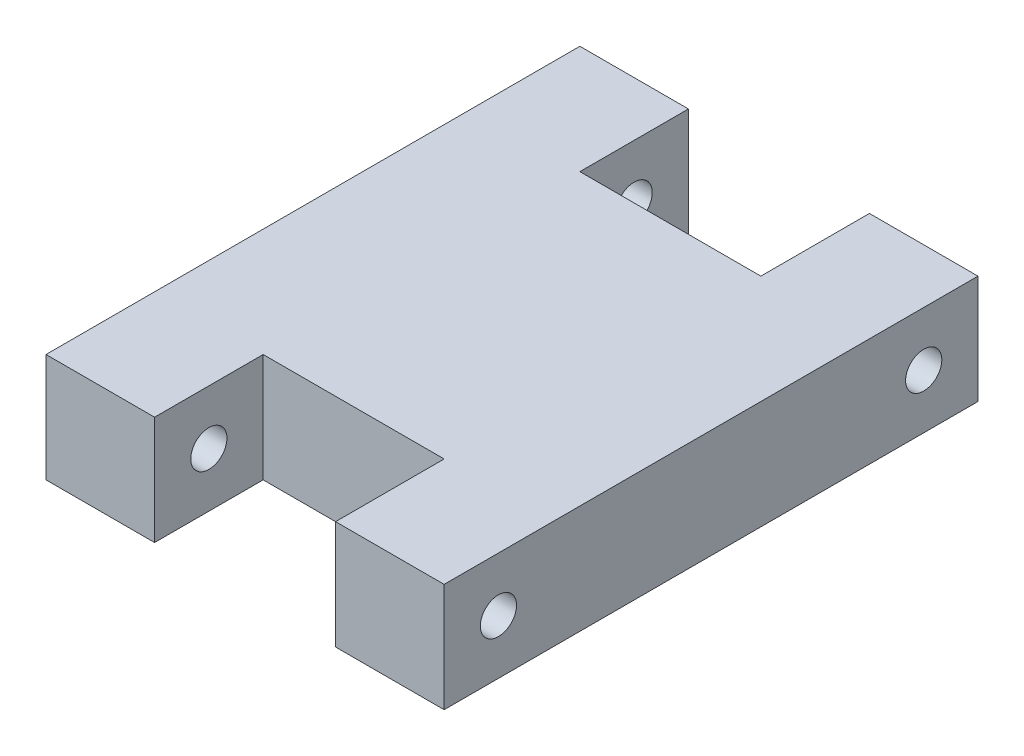
ISO-10303-21;
HEADER;
FILE_DESCRIPTION(('STEP AP214'),'2;1');
FILE_NAME('part.step','',(''),(''),'','','');
FILE_SCHEMA(('AUTOMOTIVE_DESIGN { 1 0 10303 214 1 1 1 1 }'));
ENDSEC;
DATA;
#1=APPLICATION_CONTEXT('core data for automotive mechanical design processes');
#2=APPLICATION_PROTOCOL_DEFINITION('international standard','automotive_design',2000,#1);
#3=PRODUCT_CONTEXT('',#1,'mechanical');
#4=PRODUCT('Part','Part','',(#3));
#5=PRODUCT_RELATED_PRODUCT_CATEGORY('part','',(#4));
#6=PRODUCT_DEFINITION_FORMATION('','',#4);
#7=PRODUCT_DEFINITION_CONTEXT('part definition',#1,'design');
#8=PRODUCT_DEFINITION('design','',#6,#7);
#9=PRODUCT_DEFINITION_SHAPE('','',#8);
#10=(LENGTH_UNIT() NAMED_UNIT(*) SI_UNIT(.MILLI.,.METRE.));
#11=(NAMED_UNIT(*) PLANE_ANGLE_UNIT() SI_UNIT($,.RADIAN.));
#12=(NAMED_UNIT(*) SI_UNIT($,.STERADIAN.) SOLID_ANGLE_UNIT());
#13=UNCERTAINTY_MEASURE_WITH_UNIT(LENGTH_MEASURE(1.E-05),#10,'distance_accuracy_value','');
#14=(GEOMETRIC_REPRESENTATION_CONTEXT(3) GLOBAL_UNCERTAINTY_ASSIGNED_CONTEXT((#13)) GLOBAL_UNIT_ASSIGNED_CONTEXT((#10,
#11,#12)) REPRESENTATION_CONTEXT('',''));
#15=CARTESIAN_POINT('',(0.,0.,0.));
#16=DIRECTION('',(0.,0.,1.));
#17=DIRECTION('',(1.,0.,0.));
#18=AXIS2_PLACEMENT_3D('',#15,#16,#17);
#19=CARTESIAN_POINT('',(22.,12.,29.5));
#20=DIRECTION('',(-1.,0.,0.));
#21=DIRECTION('',(0.,0.,1.));
#22=AXIS2_PLACEMENT_3D('',#19,#20,#21);
#23=PLANE('',#22);
#24=DIRECTION('',(0.,0.,-1.));
#25=VECTOR('',#24,1.);
#26=CARTESIAN_POINT('',(22.,0.,29.5));
#27=LINE('',#26,#25);
#28=CARTESIAN_POINT('',(22.,0.,29.5));
#29=VERTEX_POINT('',#28);
#30=CARTESIAN_POINT('',(22.,0.,-29.5));
#31=VERTEX_POINT('',#30);
#32=EDGE_CURVE('E218',#29,#31,#27,.T.);
#33=ORIENTED_EDGE('',*,*,#32,.T.);
#34=DIRECTION('',(0.,-1.,0.));
#35=VECTOR('',#34,1.);
#36=CARTESIAN_POINT('',(22.,12.,-29.5));
#37=LINE('',#36,#35);
#38=CARTESIAN_POINT('',(22.,12.,-29.5));
#39=VERTEX_POINT('',#38);
#40=EDGE_CURVE('E11',#39,#31,#37,.T.);
#41=ORIENTED_EDGE('',*,*,#40,.F.);
#42=DIRECTION('',(0.,0.,-1.));
#43=VECTOR('',#42,1.);
#44=CARTESIAN_POINT('',(22.,12.,29.5));
#45=LINE('',#44,#43);
#46=CARTESIAN_POINT('',(22.,12.,29.5));
#47=VERTEX_POINT('',#46);
#48=EDGE_CURVE('E149',#47,#39,#45,.T.);
#49=ORIENTED_EDGE('',*,*,#48,.F.);
#50=DIRECTION('',(0.,-1.,0.));
#51=VECTOR('',#50,1.);
#52=CARTESIAN_POINT('',(22.,12.,29.5));
#53=LINE('',#52,#51);
#54=EDGE_CURVE('E159',#47,#29,#53,.T.);
#55=ORIENTED_EDGE('',*,*,#54,.T.);
#56=EDGE_LOOP('',(#33,#41,#49,#55));
#57=FACE_BOUND('',#56,.T.);
#58=CARTESIAN_POINT('',(22.,6.,-23.5));
#59=DIRECTION('',(-1.,0.,0.));
#60=DIRECTION('',(0.,0.,1.));
#61=AXIS2_PLACEMENT_3D('',#58,#59,#60);
#62=CIRCLE('',#61,2.);
#63=CARTESIAN_POINT('',(22.,6.,-21.5));
#64=VERTEX_POINT('',#63);
#65=EDGE_CURVE('E168',#64,#64,#62,.F.);
#66=ORIENTED_EDGE('',*,*,#65,.F.);
#67=EDGE_LOOP('',(#66));
#68=FACE_BOUND('',#67,.T.);
#69=CARTESIAN_POINT('',(22.,6.,23.5));
#70=DIRECTION('',(-1.,0.,0.));
#71=DIRECTION('',(0.,0.,1.));
#72=AXIS2_PLACEMENT_3D('',#69,#70,#71);
#73=CIRCLE('',#72,2.);
#74=CARTESIAN_POINT('',(22.,6.,25.5));
#75=VERTEX_POINT('',#74);
#76=EDGE_CURVE('E395',#75,#75,#73,.T.);
#77=ORIENTED_EDGE('',*,*,#76,.T.);
#78=EDGE_LOOP('',(#77));
#79=FACE_BOUND('',#78,.T.);
#80=ADVANCED_FACE('F32',(#57,#68,#79),#23,.F.);
#81=CARTESIAN_POINT('',(-22.,12.,29.5));
#82=DIRECTION('',(1.,0.,0.));
#83=DIRECTION('',(0.,0.,-1.));
#84=AXIS2_PLACEMENT_3D('',#81,#82,#83);
#85=PLANE('',#84);
#86=DIRECTION('',(0.,0.,1.));
#87=VECTOR('',#86,1.);
#88=CARTESIAN_POINT('',(-22.,0.,29.5));
#89=LINE('',#88,#87);
#90=CARTESIAN_POINT('',(-22.,0.,-29.5));
#91=VERTEX_POINT('',#90);
#92=CARTESIAN_POINT('',(-22.,0.,29.5));
#93=VERTEX_POINT('',#92);
#94=EDGE_CURVE('E155',#91,#93,#89,.T.);
#95=ORIENTED_EDGE('',*,*,#94,.T.);
#96=DIRECTION('',(0.,-1.,0.));
#97=VECTOR('',#96,1.);
#98=CARTESIAN_POINT('',(-22.,12.,29.5));
#99=LINE('',#98,#97);
#100=CARTESIAN_POINT('',(-22.,12.,29.5));
#101=VERTEX_POINT('',#100);
#102=EDGE_CURVE('E148',#101,#93,#99,.T.);
#103=ORIENTED_EDGE('',*,*,#102,.F.);
#104=DIRECTION('',(0.,0.,1.));
#105=VECTOR('',#104,1.);
#106=CARTESIAN_POINT('',(-22.,12.,29.5));
#107=LINE('',#106,#105);
#108=CARTESIAN_POINT('',(-22.,12.,-29.5));
#109=VERTEX_POINT('',#108);
#110=EDGE_CURVE('E223',#109,#101,#107,.T.);
#111=ORIENTED_EDGE('',*,*,#110,.F.);
#112=DIRECTION('',(0.,-1.,0.));
#113=VECTOR('',#112,1.);
#114=CARTESIAN_POINT('',(-22.,12.,-29.5));
#115=LINE('',#114,#113);
#116=EDGE_CURVE('E40',#109,#91,#115,.T.);
#117=ORIENTED_EDGE('',*,*,#116,.T.);
#118=EDGE_LOOP('',(#95,#103,#111,#117));
#119=FACE_BOUND('',#118,.T.);
#120=CARTESIAN_POINT('',(-22.,6.,-23.5));
#121=DIRECTION('',(-1.,0.,0.));
#122=DIRECTION('',(0.,0.,1.));
#123=AXIS2_PLACEMENT_3D('',#120,#121,#122);
#124=CIRCLE('',#123,2.);
#125=CARTESIAN_POINT('',(-22.,6.,-21.5));
#126=VERTEX_POINT('',#125);
#127=EDGE_CURVE('E175',#126,#126,#124,.T.);
#128=ORIENTED_EDGE('',*,*,#127,.F.);
#129=EDGE_LOOP('',(#128));
#130=FACE_BOUND('',#129,.T.);
#131=CARTESIAN_POINT('',(-22.,6.,23.5));
#132=DIRECTION('',(1.,0.,0.));
#133=DIRECTION('',(0.,0.,-1.));
#134=AXIS2_PLACEMENT_3D('',#131,#132,#133);
#135=CIRCLE('',#134,2.);
#136=CARTESIAN_POINT('',(-22.,6.,21.5));
#137=VERTEX_POINT('',#136);
#138=EDGE_CURVE('E391',#137,#137,#135,.T.);
#139=ORIENTED_EDGE('',*,*,#138,.T.);
#140=EDGE_LOOP('',(#139));
#141=FACE_BOUND('',#140,.T.);
#142=ADVANCED_FACE('F240',(#119,#130,#141),#85,.F.);
#143=CARTESIAN_POINT('',(-10.,-0.000999999999999265,29.5));
#144=DIRECTION('',(-1.,0.,0.));
#145=DIRECTION('',(0.,0.,1.));
#146=AXIS2_PLACEMENT_3D('',#143,#144,#145);
#147=PLANE('',#146);
#148=DIRECTION('',(0.,1.,0.));
#149=VECTOR('',#148,1.);
#150=CARTESIAN_POINT('',(-10.,-0.000999999999999265,17.5));
#151=LINE('',#150,#149);
#152=CARTESIAN_POINT('',(-10.,0.,17.5));
#153=VERTEX_POINT('',#152);
#154=CARTESIAN_POINT('',(-10.,12.,17.5));
#155=VERTEX_POINT('',#154);
#156=EDGE_CURVE('E191',#153,#155,#151,.T.);
#157=ORIENTED_EDGE('',*,*,#156,.T.);
#158=DIRECTION('',(0.,0.,1.));
#159=VECTOR('',#158,1.);
#160=CARTESIAN_POINT('',(-10.,12.,29.5));
#161=LINE('',#160,#159);
#162=CARTESIAN_POINT('',(-10.,12.,29.5));
#163=VERTEX_POINT('',#162);
#164=EDGE_CURVE('E128',#155,#163,#161,.T.);
#165=ORIENTED_EDGE('',*,*,#164,.T.);
#166=DIRECTION('',(0.,1.,0.));
#167=VECTOR('',#166,1.);
#168=CARTESIAN_POINT('',(-10.,-0.000999999999999265,29.5));
#169=LINE('',#168,#167);
#170=CARTESIAN_POINT('',(-10.,0.,29.5));
#171=VERTEX_POINT('',#170);
#172=EDGE_CURVE('E121',#171,#163,#169,.T.);
#173=ORIENTED_EDGE('',*,*,#172,.F.);
#174=DIRECTION('',(0.,0.,1.));
#175=VECTOR('',#174,1.);
#176=CARTESIAN_POINT('',(-10.,0.,29.5));
#177=LINE('',#176,#175);
#178=EDGE_CURVE('E125',#153,#171,#177,.T.);
#179=ORIENTED_EDGE('',*,*,#178,.F.);
#180=EDGE_LOOP('',(#157,#165,#173,#179));
#181=FACE_BOUND('',#180,.T.);
#182=CARTESIAN_POINT('',(-10.,6.,23.5));
#183=DIRECTION('',(-1.,0.,0.));
#184=DIRECTION('',(0.,0.,1.));
#185=AXIS2_PLACEMENT_3D('',#182,#183,#184);
#186=CIRCLE('',#185,2.);
#187=CARTESIAN_POINT('',(-10.,6.,25.5));
#188=VERTEX_POINT('',#187);
#189=EDGE_CURVE('E180',#188,#188,#186,.F.);
#190=ORIENTED_EDGE('',*,*,#189,.F.);
#191=EDGE_LOOP('',(#190));
#192=FACE_BOUND('',#191,.T.);
#193=ADVANCED_FACE('F123',(#181,#192),#147,.F.);
#194=CARTESIAN_POINT('',(10.,-0.000999999999999265,29.5));
#195=DIRECTION('',(1.,0.,0.));
#196=DIRECTION('',(0.,0.,-1.));
#197=AXIS2_PLACEMENT_3D('',#194,#195,#196);
#198=PLANE('',#197);
#199=DIRECTION('',(0.,1.,0.));
#200=VECTOR('',#199,1.);
#201=CARTESIAN_POINT('',(10.,-0.000999999999999265,29.5));
#202=LINE('',#201,#200);
#203=CARTESIAN_POINT('',(10.,0.,29.5));
#204=VERTEX_POINT('',#203);
#205=CARTESIAN_POINT('',(10.,12.,29.5));
#206=VERTEX_POINT('',#205);
#207=EDGE_CURVE('E133',#204,#206,#202,.T.);
#208=ORIENTED_EDGE('',*,*,#207,.T.);
#209=DIRECTION('',(0.,0.,-1.));
#210=VECTOR('',#209,1.);
#211=CARTESIAN_POINT('',(10.,12.,29.5));
#212=LINE('',#211,#210);
#213=CARTESIAN_POINT('',(10.,12.,17.5));
#214=VERTEX_POINT('',#213);
#215=EDGE_CURVE('E187',#206,#214,#212,.T.);
#216=ORIENTED_EDGE('',*,*,#215,.T.);
#217=DIRECTION('',(0.,1.,0.));
#218=VECTOR('',#217,1.);
#219=CARTESIAN_POINT('',(10.,-0.000999999999999265,17.5));
#220=LINE('',#219,#218);
#221=CARTESIAN_POINT('',(10.,0.,17.5));
#222=VERTEX_POINT('',#221);
#223=EDGE_CURVE('E48',#222,#214,#220,.T.);
#224=ORIENTED_EDGE('',*,*,#223,.F.);
#225=DIRECTION('',(0.,0.,-1.));
#226=VECTOR('',#225,1.);
#227=CARTESIAN_POINT('',(10.,0.,29.5));
#228=LINE('',#227,#226);
#229=EDGE_CURVE('E172',#204,#222,#228,.T.);
#230=ORIENTED_EDGE('',*,*,#229,.F.);
#231=EDGE_LOOP('',(#208,#216,#224,#230));
#232=FACE_BOUND('',#231,.T.);
#233=CARTESIAN_POINT('',(10.,6.,23.5));
#234=DIRECTION('',(1.,0.,0.));
#235=DIRECTION('',(0.,0.,-1.));
#236=AXIS2_PLACEMENT_3D('',#233,#234,#235);
#237=CIRCLE('',#236,2.);
#238=CARTESIAN_POINT('',(10.,6.,21.5));
#239=VERTEX_POINT('',#238);
#240=EDGE_CURVE('E35',#239,#239,#237,.F.);
#241=ORIENTED_EDGE('',*,*,#240,.F.);
#242=EDGE_LOOP('',(#241));
#243=FACE_BOUND('',#242,.T.);
#244=ADVANCED_FACE('F266',(#232,#243),#198,.F.);
#245=CARTESIAN_POINT('',(-22.,12.,29.5));
#246=DIRECTION('',(0.,0.,-1.));
#247=DIRECTION('',(-1.,0.,0.));
#248=AXIS2_PLACEMENT_3D('',#245,#246,#247);
#249=PLANE('',#248);
#250=DIRECTION('',(1.,0.,0.));
#251=VECTOR('',#250,1.);
#252=CARTESIAN_POINT('',(-22.,0.,29.5));
#253=LINE('',#252,#251);
#254=EDGE_CURVE('E141',#93,#171,#253,.T.);
#255=ORIENTED_EDGE('',*,*,#254,.T.);
#256=ORIENTED_EDGE('',*,*,#172,.T.);
#257=DIRECTION('',(1.,0.,0.));
#258=VECTOR('',#257,1.);
#259=CARTESIAN_POINT('',(-22.,12.,29.5));
#260=LINE('',#259,#258);
#261=EDGE_CURVE('E162',#101,#163,#260,.T.);
#262=ORIENTED_EDGE('',*,*,#261,.F.);
#263=ORIENTED_EDGE('',*,*,#102,.T.);
#264=EDGE_LOOP('',(#255,#256,#262,#263));
#265=FACE_BOUND('',#264,.T.);
#266=ADVANCED_FACE('F146',(#265),#249,.F.);
#267=CARTESIAN_POINT('',(-22.,12.,-29.5));
#268=DIRECTION('',(0.,0.,1.));
#269=DIRECTION('',(1.,0.,0.));
#270=AXIS2_PLACEMENT_3D('',#267,#268,#269);
#271=PLANE('',#270);
#272=DIRECTION('',(-1.,0.,0.));
#273=VECTOR('',#272,1.);
#274=CARTESIAN_POINT('',(-22.,12.,-29.5));
#275=LINE('',#274,#273);
#276=CARTESIAN_POINT('',(-10.,12.,-29.5));
#277=VERTEX_POINT('',#276);
#278=EDGE_CURVE('E153',#277,#109,#275,.T.);
#279=ORIENTED_EDGE('',*,*,#278,.F.);
#280=DIRECTION('',(0.,1.,0.));
#281=VECTOR('',#280,1.);
#282=CARTESIAN_POINT('',(-10.,-0.000999999999999265,-29.5));
#283=LINE('',#282,#281);
#284=CARTESIAN_POINT('',(-10.,0.,-29.5));
#285=VERTEX_POINT('',#284);
#286=EDGE_CURVE('E209',#285,#277,#283,.T.);
#287=ORIENTED_EDGE('',*,*,#286,.F.);
#288=DIRECTION('',(-1.,0.,0.));
#289=VECTOR('',#288,1.);
#290=CARTESIAN_POINT('',(-22.,0.,-29.5));
#291=LINE('',#290,#289);
#292=EDGE_CURVE('E228',#285,#91,#291,.T.);
#293=ORIENTED_EDGE('',*,*,#292,.T.);
#294=ORIENTED_EDGE('',*,*,#116,.F.);
#295=EDGE_LOOP('',(#279,#287,#293,#294));
#296=FACE_BOUND('',#295,.T.);
#297=ADVANCED_FACE('F237',(#296),#271,.F.);
#298=CARTESIAN_POINT('',(10.,0.,-29.5));
#299=VERTEX_POINT('',#298);
#300=EDGE_CURVE('E229',#31,#299,#291,.T.);
#301=ORIENTED_EDGE('',*,*,#300,.T.);
#302=DIRECTION('',(0.,1.,0.));
#303=VECTOR('',#302,1.);
#304=CARTESIAN_POINT('',(10.,-0.000999999999999265,-29.5));
#305=LINE('',#304,#303);
#306=CARTESIAN_POINT('',(10.,12.,-29.5));
#307=VERTEX_POINT('',#306);
#308=EDGE_CURVE('E212',#299,#307,#305,.T.);
#309=ORIENTED_EDGE('',*,*,#308,.T.);
#310=EDGE_CURVE('E220',#39,#307,#275,.T.);
#311=ORIENTED_EDGE('',*,*,#310,.F.);
#312=ORIENTED_EDGE('',*,*,#40,.T.);
#313=EDGE_LOOP('',(#301,#309,#311,#312));
#314=FACE_BOUND('',#313,.T.);
#315=ADVANCED_FACE('F253',(#314),#271,.F.);
#316=EDGE_CURVE('E225',#206,#47,#260,.T.);
#317=ORIENTED_EDGE('',*,*,#316,.F.);
#318=ORIENTED_EDGE('',*,*,#207,.F.);
#319=EDGE_CURVE('E150',#204,#29,#253,.T.);
#320=ORIENTED_EDGE('',*,*,#319,.T.);
#321=ORIENTED_EDGE('',*,*,#54,.F.);
#322=EDGE_LOOP('',(#317,#318,#320,#321));
#323=FACE_BOUND('',#322,.T.);
#324=ADVANCED_FACE('F265',(#323),#249,.F.);
#325=CARTESIAN_POINT('',(22.,12.,-29.5));
#326=DIRECTION('',(0.,-1.,0.));
#327=DIRECTION('',(0.,0.,-1.));
#328=AXIS2_PLACEMENT_3D('',#325,#326,#327);
#329=PLANE('',#328);
#330=ORIENTED_EDGE('',*,*,#261,.T.);
#331=ORIENTED_EDGE('',*,*,#164,.F.);
#332=DIRECTION('',(-1.,0.,0.));
#333=VECTOR('',#332,1.);
#334=CARTESIAN_POINT('',(-10.,12.,17.5));
#335=LINE('',#334,#333);
#336=EDGE_CURVE('E134',#214,#155,#335,.T.);
#337=ORIENTED_EDGE('',*,*,#336,.F.);
#338=ORIENTED_EDGE('',*,*,#215,.F.);
#339=ORIENTED_EDGE('',*,*,#316,.T.);
#340=ORIENTED_EDGE('',*,*,#48,.T.);
#341=ORIENTED_EDGE('',*,*,#310,.T.);
#342=DIRECTION('',(0.,0.,-1.));
#343=VECTOR('',#342,1.);
#344=CARTESIAN_POINT('',(10.,12.,-29.5));
#345=LINE('',#344,#343);
#346=CARTESIAN_POINT('',(10.,12.,-17.5));
#347=VERTEX_POINT('',#346);
#348=EDGE_CURVE('E206',#347,#307,#345,.T.);
#349=ORIENTED_EDGE('',*,*,#348,.F.);
#350=DIRECTION('',(1.,0.,0.));
#351=VECTOR('',#350,1.);
#352=CARTESIAN_POINT('',(-10.,12.,-17.5));
#353=LINE('',#352,#351);
#354=CARTESIAN_POINT('',(-10.,12.,-17.5));
#355=VERTEX_POINT('',#354);
#356=EDGE_CURVE('E204',#355,#347,#353,.T.);
#357=ORIENTED_EDGE('',*,*,#356,.F.);
#358=DIRECTION('',(0.,0.,1.));
#359=VECTOR('',#358,1.);
#360=CARTESIAN_POINT('',(-10.,12.,-29.5));
#361=LINE('',#360,#359);
#362=EDGE_CURVE('E201',#277,#355,#361,.T.);
#363=ORIENTED_EDGE('',*,*,#362,.F.);
#364=ORIENTED_EDGE('',*,*,#278,.T.);
#365=ORIENTED_EDGE('',*,*,#110,.T.);
#366=EDGE_LOOP('',(#330,#331,#337,#338,#339,#340,#341,#349,#357,#363,#364,#365));
#367=FACE_BOUND('',#366,.T.);
#368=ADVANCED_FACE('F243',(#367),#329,.F.);
#369=CARTESIAN_POINT('',(22.,0.,-29.5));
#370=DIRECTION('',(0.,-1.,0.));
#371=DIRECTION('',(0.,0.,-1.));
#372=AXIS2_PLACEMENT_3D('',#369,#370,#371);
#373=PLANE('',#372);
#374=ORIENTED_EDGE('',*,*,#178,.T.);
#375=ORIENTED_EDGE('',*,*,#254,.F.);
#376=ORIENTED_EDGE('',*,*,#94,.F.);
#377=ORIENTED_EDGE('',*,*,#292,.F.);
#378=DIRECTION('',(0.,0.,1.));
#379=VECTOR('',#378,1.);
#380=CARTESIAN_POINT('',(-10.,0.,-29.5));
#381=LINE('',#380,#379);
#382=CARTESIAN_POINT('',(-10.,0.,-17.5));
#383=VERTEX_POINT('',#382);
#384=EDGE_CURVE('E198',#285,#383,#381,.T.);
#385=ORIENTED_EDGE('',*,*,#384,.T.);
#386=DIRECTION('',(1.,0.,0.));
#387=VECTOR('',#386,1.);
#388=CARTESIAN_POINT('',(-10.,0.,-17.5));
#389=LINE('',#388,#387);
#390=CARTESIAN_POINT('',(10.,0.,-17.5));
#391=VERTEX_POINT('',#390);
#392=EDGE_CURVE('E211',#383,#391,#389,.T.);
#393=ORIENTED_EDGE('',*,*,#392,.T.);
#394=DIRECTION('',(0.,0.,-1.));
#395=VECTOR('',#394,1.);
#396=CARTESIAN_POINT('',(10.,0.,-29.5));
#397=LINE('',#396,#395);
#398=EDGE_CURVE('E193',#391,#299,#397,.T.);
#399=ORIENTED_EDGE('',*,*,#398,.T.);
#400=ORIENTED_EDGE('',*,*,#300,.F.);
#401=ORIENTED_EDGE('',*,*,#32,.F.);
#402=ORIENTED_EDGE('',*,*,#319,.F.);
#403=ORIENTED_EDGE('',*,*,#229,.T.);
#404=DIRECTION('',(-1.,0.,0.));
#405=VECTOR('',#404,1.);
#406=CARTESIAN_POINT('',(-10.,0.,17.5));
#407=LINE('',#406,#405);
#408=EDGE_CURVE('E143',#222,#153,#407,.T.);
#409=ORIENTED_EDGE('',*,*,#408,.T.);
#410=EDGE_LOOP('',(#374,#375,#376,#377,#385,#393,#399,#400,#401,#402,#403,#409));
#411=FACE_BOUND('',#410,.T.);
#412=ADVANCED_FACE('F139',(#411),#373,.T.);
#413=CARTESIAN_POINT('',(-10.,-0.000999999999999265,-29.5));
#414=DIRECTION('',(-1.,0.,0.));
#415=DIRECTION('',(0.,0.,1.));
#416=AXIS2_PLACEMENT_3D('',#413,#414,#415);
#417=PLANE('',#416);
#418=CARTESIAN_POINT('',(-10.,6.,-23.5));
#419=DIRECTION('',(-1.,0.,0.));
#420=DIRECTION('',(0.,0.,1.));
#421=AXIS2_PLACEMENT_3D('',#418,#419,#420);
#422=CIRCLE('',#421,2.);
#423=CARTESIAN_POINT('',(-10.,6.,-21.5));
#424=VERTEX_POINT('',#423);
#425=EDGE_CURVE('E167',#424,#424,#422,.T.);
#426=ORIENTED_EDGE('',*,*,#425,.T.);
#427=EDGE_LOOP('',(#426));
#428=FACE_BOUND('',#427,.T.);
#429=ORIENTED_EDGE('',*,*,#286,.T.);
#430=ORIENTED_EDGE('',*,*,#362,.T.);
#431=DIRECTION('',(0.,1.,0.));
#432=VECTOR('',#431,1.);
#433=CARTESIAN_POINT('',(-10.,-0.000999999999999265,-17.5));
#434=LINE('',#433,#432);
#435=EDGE_CURVE('E208',#383,#355,#434,.T.);
#436=ORIENTED_EDGE('',*,*,#435,.F.);
#437=ORIENTED_EDGE('',*,*,#384,.F.);
#438=EDGE_LOOP('',(#429,#430,#436,#437));
#439=FACE_BOUND('',#438,.T.);
#440=ADVANCED_FACE('F249',(#428,#439),#417,.F.);
#441=CARTESIAN_POINT('',(10.,-0.000999999999999265,-29.5));
#442=DIRECTION('',(1.,0.,0.));
#443=DIRECTION('',(0.,0.,-1.));
#444=AXIS2_PLACEMENT_3D('',#441,#442,#443);
#445=PLANE('',#444);
#446=CARTESIAN_POINT('',(10.,6.,-23.5));
#447=DIRECTION('',(1.,0.,0.));
#448=DIRECTION('',(0.,0.,-1.));
#449=AXIS2_PLACEMENT_3D('',#446,#447,#448);
#450=CIRCLE('',#449,2.);
#451=CARTESIAN_POINT('',(10.,6.,-25.5));
#452=VERTEX_POINT('',#451);
#453=EDGE_CURVE('E165',#452,#452,#450,.T.);
#454=ORIENTED_EDGE('',*,*,#453,.T.);
#455=EDGE_LOOP('',(#454));
#456=FACE_BOUND('',#455,.T.);
#457=DIRECTION('',(0.,1.,0.));
#458=VECTOR('',#457,1.);
#459=CARTESIAN_POINT('',(10.,-0.000999999999999265,-17.5));
#460=LINE('',#459,#458);
#461=EDGE_CURVE('E56',#391,#347,#460,.T.);
#462=ORIENTED_EDGE('',*,*,#461,.T.);
#463=ORIENTED_EDGE('',*,*,#348,.T.);
#464=ORIENTED_EDGE('',*,*,#308,.F.);
#465=ORIENTED_EDGE('',*,*,#398,.F.);
#466=EDGE_LOOP('',(#462,#463,#464,#465));
#467=FACE_BOUND('',#466,.T.);
#468=ADVANCED_FACE('F252',(#456,#467),#445,.F.);
#469=CARTESIAN_POINT('',(-10.,-0.000999999999999265,-17.5));
#470=DIRECTION('',(0.,0.,1.));
#471=DIRECTION('',(1.,0.,0.));
#472=AXIS2_PLACEMENT_3D('',#469,#470,#471);
#473=PLANE('',#472);
#474=ORIENTED_EDGE('',*,*,#435,.T.);
#475=ORIENTED_EDGE('',*,*,#356,.T.);
#476=ORIENTED_EDGE('',*,*,#461,.F.);
#477=ORIENTED_EDGE('',*,*,#392,.F.);
#478=EDGE_LOOP('',(#474,#475,#476,#477));
#479=FACE_BOUND('',#478,.T.);
#480=ADVANCED_FACE('F250',(#479),#473,.F.);
#481=CARTESIAN_POINT('',(-10.,-0.000999999999999265,17.5));
#482=DIRECTION('',(0.,0.,-1.));
#483=DIRECTION('',(-1.,0.,0.));
#484=AXIS2_PLACEMENT_3D('',#481,#482,#483);
#485=PLANE('',#484);
#486=ORIENTED_EDGE('',*,*,#223,.T.);
#487=ORIENTED_EDGE('',*,*,#336,.T.);
#488=ORIENTED_EDGE('',*,*,#156,.F.);
#489=ORIENTED_EDGE('',*,*,#408,.F.);
#490=EDGE_LOOP('',(#486,#487,#488,#489));
#491=FACE_BOUND('',#490,.T.);
#492=ADVANCED_FACE('F270',(#491),#485,.F.);
#493=CARTESIAN_POINT('',(27.6568542494924,6.,-23.5));
#494=DIRECTION('',(-1.,0.,0.));
#495=DIRECTION('',(0.,0.,1.));
#496=AXIS2_PLACEMENT_3D('',#493,#494,#495);
#497=CYLINDRICAL_SURFACE('',#496,2.);
#498=ORIENTED_EDGE('',*,*,#65,.T.);
#499=EDGE_LOOP('',(#498));
#500=FACE_BOUND('',#499,.T.);
#501=ORIENTED_EDGE('',*,*,#453,.F.);
#502=EDGE_LOOP('',(#501));
#503=FACE_BOUND('',#502,.T.);
#504=ADVANCED_FACE('F272',(#500,#503),#497,.F.);
#505=ORIENTED_EDGE('',*,*,#127,.T.);
#506=EDGE_LOOP('',(#505));
#507=FACE_BOUND('',#506,.T.);
#508=ORIENTED_EDGE('',*,*,#425,.F.);
#509=EDGE_LOOP('',(#508));
#510=FACE_BOUND('',#509,.T.);
#511=ADVANCED_FACE('F278',(#507,#510),#497,.F.);
#512=CARTESIAN_POINT('',(27.6568542494924,6.,23.5));
#513=DIRECTION('',(-1.,0.,0.));
#514=DIRECTION('',(0.,0.,1.));
#515=AXIS2_PLACEMENT_3D('',#512,#513,#514);
#516=CYLINDRICAL_SURFACE('',#515,2.);
#517=ORIENTED_EDGE('',*,*,#76,.F.);
#518=EDGE_LOOP('',(#517));
#519=FACE_BOUND('',#518,.T.);
#520=ORIENTED_EDGE('',*,*,#240,.T.);
#521=EDGE_LOOP('',(#520));
#522=FACE_BOUND('',#521,.T.);
#523=ADVANCED_FACE('F349',(#519,#522),#516,.F.);
#524=ORIENTED_EDGE('',*,*,#138,.F.);
#525=EDGE_LOOP('',(#524));
#526=FACE_BOUND('',#525,.T.);
#527=ORIENTED_EDGE('',*,*,#189,.T.);
#528=EDGE_LOOP('',(#527));
#529=FACE_BOUND('',#528,.T.);
#530=ADVANCED_FACE('F374',(#526,#529),#516,.F.);
#531=CLOSED_SHELL('',(#80,#142,#193,#244,#266,#297,#315,#324,#368,#412,#440,#468,#480,#492,#504,
#511,#523,#530));
#532=MANIFOLD_SOLID_BREP('B2',#531);
#533=ADVANCED_BREP_SHAPE_REPRESENTATION('',(#18,#532),#14);
#534=SHAPE_DEFINITION_REPRESENTATION(#9,#533);
ENDSEC;
END-ISO-10303-21;
